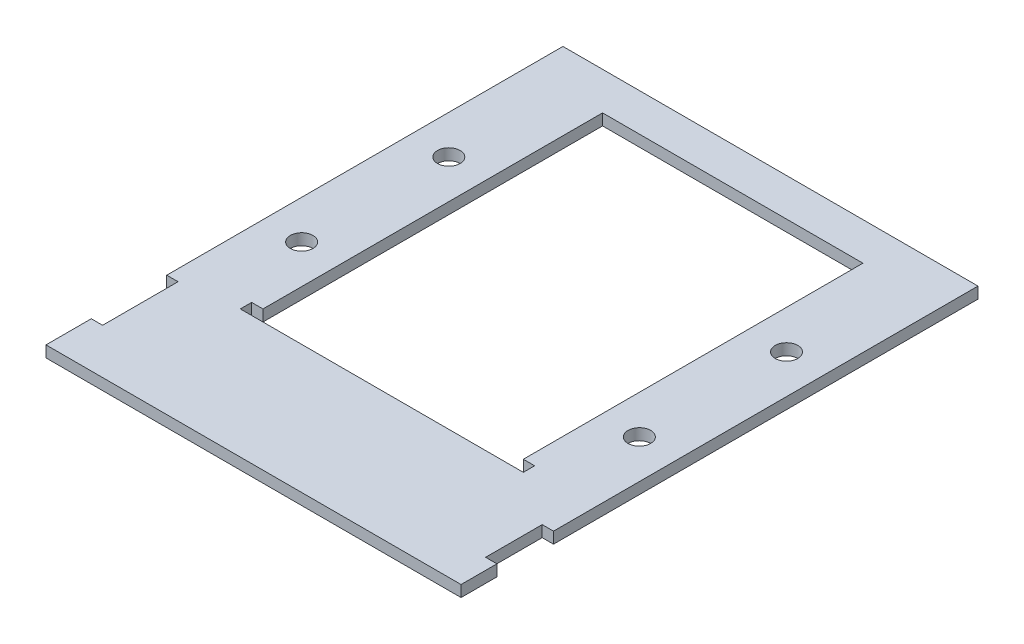
ISO-10303-21;
HEADER;
FILE_DESCRIPTION(('STEP AP214'),'2;1');
FILE_NAME('part.step','',(''),(''),'','','');
FILE_SCHEMA(('AUTOMOTIVE_DESIGN { 1 0 10303 214 1 1 1 1 }'));
ENDSEC;
DATA;
#1=APPLICATION_CONTEXT('core data for automotive mechanical design processes');
#2=APPLICATION_PROTOCOL_DEFINITION('international standard','automotive_design',2000,#1);
#3=PRODUCT_CONTEXT('',#1,'mechanical');
#4=PRODUCT('Part','Part','',(#3));
#5=PRODUCT_RELATED_PRODUCT_CATEGORY('part','',(#4));
#6=PRODUCT_DEFINITION_FORMATION('','',#4);
#7=PRODUCT_DEFINITION_CONTEXT('part definition',#1,'design');
#8=PRODUCT_DEFINITION('design','',#6,#7);
#9=PRODUCT_DEFINITION_SHAPE('','',#8);
#10=(LENGTH_UNIT() NAMED_UNIT(*) SI_UNIT(.MILLI.,.METRE.));
#11=(NAMED_UNIT(*) PLANE_ANGLE_UNIT() SI_UNIT($,.RADIAN.));
#12=(NAMED_UNIT(*) SI_UNIT($,.STERADIAN.) SOLID_ANGLE_UNIT());
#13=UNCERTAINTY_MEASURE_WITH_UNIT(LENGTH_MEASURE(1.E-05),#10,'distance_accuracy_value','');
#14=(GEOMETRIC_REPRESENTATION_CONTEXT(3) GLOBAL_UNCERTAINTY_ASSIGNED_CONTEXT((#13)) GLOBAL_UNIT_ASSIGNED_CONTEXT((#10,
#11,#12)) REPRESENTATION_CONTEXT('',''));
#15=CARTESIAN_POINT('',(0.,0.,0.));
#16=DIRECTION('',(0.,0.,1.));
#17=DIRECTION('',(1.,0.,0.));
#18=AXIS2_PLACEMENT_3D('',#15,#16,#17);
#19=CARTESIAN_POINT('',(0.,3.,-37.));
#20=DIRECTION('',(0.,0.,-1.));
#21=DIRECTION('',(-1.,0.,0.));
#22=AXIS2_PLACEMENT_3D('',#19,#20,#21);
#23=PLANE('',#22);
#24=DIRECTION('',(1.,0.,0.));
#25=VECTOR('',#24,1.);
#26=CARTESIAN_POINT('',(0.,0.,-37.));
#27=LINE('',#26,#25);
#28=CARTESIAN_POINT('',(17.5,0.,-37.));
#29=VERTEX_POINT('',#28);
#30=CARTESIAN_POINT('',(92.5,0.,-37.));
#31=VERTEX_POINT('',#30);
#32=EDGE_CURVE('E256',#29,#31,#27,.T.);
#33=ORIENTED_EDGE('',*,*,#32,.F.);
#34=DIRECTION('',(0.,-1.,0.));
#35=VECTOR('',#34,1.);
#36=CARTESIAN_POINT('',(17.5,3.,-37.));
#37=LINE('',#36,#35);
#38=CARTESIAN_POINT('',(17.5,3.,-37.));
#39=VERTEX_POINT('',#38);
#40=EDGE_CURVE('E11',#39,#29,#37,.T.);
#41=ORIENTED_EDGE('',*,*,#40,.F.);
#42=DIRECTION('',(1.,0.,0.));
#43=VECTOR('',#42,1.);
#44=CARTESIAN_POINT('',(0.,3.,-37.));
#45=LINE('',#44,#43);
#46=CARTESIAN_POINT('',(92.5,3.,-37.));
#47=VERTEX_POINT('',#46);
#48=EDGE_CURVE('E635',#39,#47,#45,.T.);
#49=ORIENTED_EDGE('',*,*,#48,.T.);
#50=DIRECTION('',(0.,-1.,0.));
#51=VECTOR('',#50,1.);
#52=CARTESIAN_POINT('',(92.5,3.,-37.));
#53=LINE('',#52,#51);
#54=EDGE_CURVE('E54',#47,#31,#53,.T.);
#55=ORIENTED_EDGE('',*,*,#54,.T.);
#56=EDGE_LOOP('',(#33,#41,#49,#55));
#57=FACE_BOUND('',#56,.T.);
#58=ADVANCED_FACE('F35',(#57),#23,.T.);
#59=CARTESIAN_POINT('',(17.5,3.,0.));
#60=DIRECTION('',(-1.,0.,0.));
#61=DIRECTION('',(0.,0.,1.));
#62=AXIS2_PLACEMENT_3D('',#59,#60,#61);
#63=PLANE('',#62);
#64=DIRECTION('',(0.,0.,-1.));
#65=VECTOR('',#64,1.);
#66=CARTESIAN_POINT('',(17.5,0.,0.));
#67=LINE('',#66,#65);
#68=CARTESIAN_POINT('',(17.5,0.,-40.));
#69=VERTEX_POINT('',#68);
#70=EDGE_CURVE('E258',#29,#69,#67,.T.);
#71=ORIENTED_EDGE('',*,*,#70,.T.);
#72=DIRECTION('',(0.,-1.,0.));
#73=VECTOR('',#72,1.);
#74=CARTESIAN_POINT('',(17.5,3.,-40.));
#75=LINE('',#74,#73);
#76=CARTESIAN_POINT('',(17.5,3.,-40.));
#77=VERTEX_POINT('',#76);
#78=EDGE_CURVE('E45',#77,#69,#75,.T.);
#79=ORIENTED_EDGE('',*,*,#78,.F.);
#80=DIRECTION('',(0.,0.,-1.));
#81=VECTOR('',#80,1.);
#82=CARTESIAN_POINT('',(17.5,3.,0.));
#83=LINE('',#82,#81);
#84=EDGE_CURVE('E633',#39,#77,#83,.T.);
#85=ORIENTED_EDGE('',*,*,#84,.F.);
#86=ORIENTED_EDGE('',*,*,#40,.T.);
#87=EDGE_LOOP('',(#71,#79,#85,#86));
#88=FACE_BOUND('',#87,.T.);
#89=ADVANCED_FACE('F380',(#88),#63,.F.);
#90=CARTESIAN_POINT('',(0.,3.,-40.));
#91=DIRECTION('',(0.,0.,-1.));
#92=DIRECTION('',(-1.,0.,0.));
#93=AXIS2_PLACEMENT_3D('',#90,#91,#92);
#94=PLANE('',#93);
#95=DIRECTION('',(1.,0.,0.));
#96=VECTOR('',#95,1.);
#97=CARTESIAN_POINT('',(0.,0.,-40.));
#98=LINE('',#97,#96);
#99=CARTESIAN_POINT('',(20.5,0.,-40.));
#100=VERTEX_POINT('',#99);
#101=EDGE_CURVE('E261',#69,#100,#98,.T.);
#102=ORIENTED_EDGE('',*,*,#101,.T.);
#103=DIRECTION('',(0.,-1.,0.));
#104=VECTOR('',#103,1.);
#105=CARTESIAN_POINT('',(20.5,3.,-40.));
#106=LINE('',#105,#104);
#107=CARTESIAN_POINT('',(20.5,3.,-40.));
#108=VERTEX_POINT('',#107);
#109=EDGE_CURVE('E285',#108,#100,#106,.T.);
#110=ORIENTED_EDGE('',*,*,#109,.F.);
#111=DIRECTION('',(1.,0.,0.));
#112=VECTOR('',#111,1.);
#113=CARTESIAN_POINT('',(0.,3.,-40.));
#114=LINE('',#113,#112);
#115=EDGE_CURVE('E629',#77,#108,#114,.T.);
#116=ORIENTED_EDGE('',*,*,#115,.F.);
#117=ORIENTED_EDGE('',*,*,#78,.T.);
#118=EDGE_LOOP('',(#102,#110,#116,#117));
#119=FACE_BOUND('',#118,.T.);
#120=ADVANCED_FACE('F385',(#119),#94,.F.);
#121=CARTESIAN_POINT('',(20.5,3.,0.));
#122=DIRECTION('',(-1.,0.,0.));
#123=DIRECTION('',(0.,0.,1.));
#124=AXIS2_PLACEMENT_3D('',#121,#122,#123);
#125=PLANE('',#124);
#126=DIRECTION('',(0.,0.,-1.));
#127=VECTOR('',#126,1.);
#128=CARTESIAN_POINT('',(20.5,0.,0.));
#129=LINE('',#128,#127);
#130=CARTESIAN_POINT('',(20.5,0.,-130.));
#131=VERTEX_POINT('',#130);
#132=EDGE_CURVE('E264',#100,#131,#129,.T.);
#133=ORIENTED_EDGE('',*,*,#132,.T.);
#134=DIRECTION('',(0.,-1.,0.));
#135=VECTOR('',#134,1.);
#136=CARTESIAN_POINT('',(20.5,3.,-130.));
#137=LINE('',#136,#135);
#138=CARTESIAN_POINT('',(20.5,3.,-130.));
#139=VERTEX_POINT('',#138);
#140=EDGE_CURVE('E283',#139,#131,#137,.T.);
#141=ORIENTED_EDGE('',*,*,#140,.F.);
#142=DIRECTION('',(0.,0.,-1.));
#143=VECTOR('',#142,1.);
#144=CARTESIAN_POINT('',(20.5,3.,0.));
#145=LINE('',#144,#143);
#146=EDGE_CURVE('E627',#108,#139,#145,.T.);
#147=ORIENTED_EDGE('',*,*,#146,.F.);
#148=ORIENTED_EDGE('',*,*,#109,.T.);
#149=EDGE_LOOP('',(#133,#141,#147,#148));
#150=FACE_BOUND('',#149,.T.);
#151=ADVANCED_FACE('F583',(#150),#125,.F.);
#152=CARTESIAN_POINT('',(0.,3.,-130.));
#153=DIRECTION('',(0.,0.,1.));
#154=DIRECTION('',(1.,0.,0.));
#155=AXIS2_PLACEMENT_3D('',#152,#153,#154);
#156=PLANE('',#155);
#157=DIRECTION('',(-1.,0.,0.));
#158=VECTOR('',#157,1.);
#159=CARTESIAN_POINT('',(0.,0.,-130.));
#160=LINE('',#159,#158);
#161=CARTESIAN_POINT('',(89.5,0.,-130.));
#162=VERTEX_POINT('',#161);
#163=EDGE_CURVE('E267',#162,#131,#160,.T.);
#164=ORIENTED_EDGE('',*,*,#163,.F.);
#165=DIRECTION('',(0.,-1.,0.));
#166=VECTOR('',#165,1.);
#167=CARTESIAN_POINT('',(89.5,3.,-130.));
#168=LINE('',#167,#166);
#169=CARTESIAN_POINT('',(89.5,3.,-130.));
#170=VERTEX_POINT('',#169);
#171=EDGE_CURVE('E188',#170,#162,#168,.T.);
#172=ORIENTED_EDGE('',*,*,#171,.F.);
#173=DIRECTION('',(-1.,0.,0.));
#174=VECTOR('',#173,1.);
#175=CARTESIAN_POINT('',(0.,3.,-130.));
#176=LINE('',#175,#174);
#177=EDGE_CURVE('E199',#170,#139,#176,.T.);
#178=ORIENTED_EDGE('',*,*,#177,.T.);
#179=ORIENTED_EDGE('',*,*,#140,.T.);
#180=EDGE_LOOP('',(#164,#172,#178,#179));
#181=FACE_BOUND('',#180,.T.);
#182=ADVANCED_FACE('F574',(#181),#156,.T.);
#183=CARTESIAN_POINT('',(89.5,3.,0.));
#184=DIRECTION('',(-1.,0.,0.));
#185=DIRECTION('',(0.,0.,1.));
#186=AXIS2_PLACEMENT_3D('',#183,#184,#185);
#187=PLANE('',#186);
#188=DIRECTION('',(0.,0.,-1.));
#189=VECTOR('',#188,1.);
#190=CARTESIAN_POINT('',(89.5,0.,0.));
#191=LINE('',#190,#189);
#192=CARTESIAN_POINT('',(89.5,0.,-40.));
#193=VERTEX_POINT('',#192);
#194=EDGE_CURVE('E184',#193,#162,#191,.T.);
#195=ORIENTED_EDGE('',*,*,#194,.F.);
#196=DIRECTION('',(0.,-1.,0.));
#197=VECTOR('',#196,1.);
#198=CARTESIAN_POINT('',(89.5,3.,-40.));
#199=LINE('',#198,#197);
#200=CARTESIAN_POINT('',(89.5,3.,-40.));
#201=VERTEX_POINT('',#200);
#202=EDGE_CURVE('E179',#201,#193,#199,.T.);
#203=ORIENTED_EDGE('',*,*,#202,.F.);
#204=DIRECTION('',(0.,0.,-1.));
#205=VECTOR('',#204,1.);
#206=CARTESIAN_POINT('',(89.5,3.,0.));
#207=LINE('',#206,#205);
#208=EDGE_CURVE('E182',#201,#170,#207,.T.);
#209=ORIENTED_EDGE('',*,*,#208,.T.);
#210=ORIENTED_EDGE('',*,*,#171,.T.);
#211=EDGE_LOOP('',(#195,#203,#209,#210));
#212=FACE_BOUND('',#211,.T.);
#213=ADVANCED_FACE('F181',(#212),#187,.T.);
#214=CARTESIAN_POINT('',(0.,3.,-40.));
#215=DIRECTION('',(0.,0.,1.));
#216=DIRECTION('',(1.,0.,0.));
#217=AXIS2_PLACEMENT_3D('',#214,#215,#216);
#218=PLANE('',#217);
#219=DIRECTION('',(-1.,0.,0.));
#220=VECTOR('',#219,1.);
#221=CARTESIAN_POINT('',(0.,0.,-40.));
#222=LINE('',#221,#220);
#223=CARTESIAN_POINT('',(92.5,0.,-40.));
#224=VERTEX_POINT('',#223);
#225=EDGE_CURVE('E271',#224,#193,#222,.T.);
#226=ORIENTED_EDGE('',*,*,#225,.F.);
#227=DIRECTION('',(0.,-1.,0.));
#228=VECTOR('',#227,1.);
#229=CARTESIAN_POINT('',(92.5,3.,-40.));
#230=LINE('',#229,#228);
#231=CARTESIAN_POINT('',(92.5,3.,-40.));
#232=VERTEX_POINT('',#231);
#233=EDGE_CURVE('E115',#232,#224,#230,.T.);
#234=ORIENTED_EDGE('',*,*,#233,.F.);
#235=DIRECTION('',(-1.,0.,0.));
#236=VECTOR('',#235,1.);
#237=CARTESIAN_POINT('',(0.,3.,-40.));
#238=LINE('',#237,#236);
#239=EDGE_CURVE('E197',#232,#201,#238,.T.);
#240=ORIENTED_EDGE('',*,*,#239,.T.);
#241=ORIENTED_EDGE('',*,*,#202,.T.);
#242=EDGE_LOOP('',(#226,#234,#240,#241));
#243=FACE_BOUND('',#242,.T.);
#244=ADVANCED_FACE('F201',(#243),#218,.T.);
#245=CARTESIAN_POINT('',(0.,3.,-3.));
#246=DIRECTION('',(0.,0.,1.));
#247=DIRECTION('',(1.,0.,0.));
#248=AXIS2_PLACEMENT_3D('',#245,#246,#247);
#249=PLANE('',#248);
#250=DIRECTION('',(-1.,0.,0.));
#251=VECTOR('',#250,1.);
#252=CARTESIAN_POINT('',(0.,0.,-3.));
#253=LINE('',#252,#251);
#254=CARTESIAN_POINT('',(110.,0.,-3.));
#255=VERTEX_POINT('',#254);
#256=CARTESIAN_POINT('',(0.,0.,-3.));
#257=VERTEX_POINT('',#256);
#258=EDGE_CURVE('E220',#255,#257,#253,.T.);
#259=ORIENTED_EDGE('',*,*,#258,.F.);
#260=DIRECTION('',(0.,-1.,0.));
#261=VECTOR('',#260,1.);
#262=CARTESIAN_POINT('',(110.,3.,-3.));
#263=LINE('',#262,#261);
#264=CARTESIAN_POINT('',(110.,3.,-3.));
#265=VERTEX_POINT('',#264);
#266=EDGE_CURVE('E39',#265,#255,#263,.T.);
#267=ORIENTED_EDGE('',*,*,#266,.F.);
#268=DIRECTION('',(-1.,0.,0.));
#269=VECTOR('',#268,1.);
#270=CARTESIAN_POINT('',(0.,3.,-3.));
#271=LINE('',#270,#269);
#272=CARTESIAN_POINT('',(0.,3.,-3.));
#273=VERTEX_POINT('',#272);
#274=EDGE_CURVE('E326',#265,#273,#271,.T.);
#275=ORIENTED_EDGE('',*,*,#274,.T.);
#276=DIRECTION('',(0.,-1.,0.));
#277=VECTOR('',#276,1.);
#278=CARTESIAN_POINT('',(0.,3.,-3.));
#279=LINE('',#278,#277);
#280=EDGE_CURVE('E210',#273,#257,#279,.T.);
#281=ORIENTED_EDGE('',*,*,#280,.T.);
#282=EDGE_LOOP('',(#259,#267,#275,#281));
#283=FACE_BOUND('',#282,.T.);
#284=ADVANCED_FACE('F324',(#283),#249,.T.);
#285=CARTESIAN_POINT('',(110.,3.,0.));
#286=DIRECTION('',(-1.,0.,0.));
#287=DIRECTION('',(0.,0.,1.));
#288=AXIS2_PLACEMENT_3D('',#285,#286,#287);
#289=PLANE('',#288);
#290=DIRECTION('',(0.,0.,-1.));
#291=VECTOR('',#290,1.);
#292=CARTESIAN_POINT('',(110.,0.,0.));
#293=LINE('',#292,#291);
#294=CARTESIAN_POINT('',(110.,0.,-12.5));
#295=VERTEX_POINT('',#294);
#296=EDGE_CURVE('E223',#255,#295,#293,.T.);
#297=ORIENTED_EDGE('',*,*,#296,.T.);
#298=DIRECTION('',(0.,-1.,0.));
#299=VECTOR('',#298,1.);
#300=CARTESIAN_POINT('',(110.,3.,-12.5));
#301=LINE('',#300,#299);
#302=CARTESIAN_POINT('',(110.,3.,-12.5));
#303=VERTEX_POINT('',#302);
#304=EDGE_CURVE('E311',#303,#295,#301,.T.);
#305=ORIENTED_EDGE('',*,*,#304,.F.);
#306=DIRECTION('',(0.,0.,-1.));
#307=VECTOR('',#306,1.);
#308=CARTESIAN_POINT('',(110.,3.,0.));
#309=LINE('',#308,#307);
#310=EDGE_CURVE('E319',#265,#303,#309,.T.);
#311=ORIENTED_EDGE('',*,*,#310,.F.);
#312=ORIENTED_EDGE('',*,*,#266,.T.);
#313=EDGE_LOOP('',(#297,#305,#311,#312));
#314=FACE_BOUND('',#313,.T.);
#315=ADVANCED_FACE('F318',(#314),#289,.F.);
#316=CARTESIAN_POINT('',(0.,3.,-12.5));
#317=DIRECTION('',(0.,0.,-1.));
#318=DIRECTION('',(-1.,0.,0.));
#319=AXIS2_PLACEMENT_3D('',#316,#317,#318);
#320=PLANE('',#319);
#321=DIRECTION('',(1.,0.,0.));
#322=VECTOR('',#321,1.);
#323=CARTESIAN_POINT('',(0.,0.,-12.5));
#324=LINE('',#323,#322);
#325=CARTESIAN_POINT('',(107.,0.,-12.5));
#326=VERTEX_POINT('',#325);
#327=EDGE_CURVE('E226',#326,#295,#324,.T.);
#328=ORIENTED_EDGE('',*,*,#327,.F.);
#329=DIRECTION('',(0.,-1.,0.));
#330=VECTOR('',#329,1.);
#331=CARTESIAN_POINT('',(107.,3.,-12.5));
#332=LINE('',#331,#330);
#333=CARTESIAN_POINT('',(107.,3.,-12.5));
#334=VERTEX_POINT('',#333);
#335=EDGE_CURVE('E310',#334,#326,#332,.T.);
#336=ORIENTED_EDGE('',*,*,#335,.F.);
#337=DIRECTION('',(1.,0.,0.));
#338=VECTOR('',#337,1.);
#339=CARTESIAN_POINT('',(0.,3.,-12.5));
#340=LINE('',#339,#338);
#341=EDGE_CURVE('E655',#334,#303,#340,.T.);
#342=ORIENTED_EDGE('',*,*,#341,.T.);
#343=ORIENTED_EDGE('',*,*,#304,.T.);
#344=EDGE_LOOP('',(#328,#336,#342,#343));
#345=FACE_BOUND('',#344,.T.);
#346=ADVANCED_FACE('F369',(#345),#320,.T.);
#347=CARTESIAN_POINT('',(107.,3.,0.));
#348=DIRECTION('',(1.,0.,0.));
#349=DIRECTION('',(0.,0.,-1.));
#350=AXIS2_PLACEMENT_3D('',#347,#348,#349);
#351=PLANE('',#350);
#352=DIRECTION('',(0.,0.,1.));
#353=VECTOR('',#352,1.);
#354=CARTESIAN_POINT('',(107.,0.,0.));
#355=LINE('',#354,#353);
#356=CARTESIAN_POINT('',(107.,0.,-27.5));
#357=VERTEX_POINT('',#356);
#358=EDGE_CURVE('E229',#357,#326,#355,.T.);
#359=ORIENTED_EDGE('',*,*,#358,.F.);
#360=DIRECTION('',(0.,-1.,0.));
#361=VECTOR('',#360,1.);
#362=CARTESIAN_POINT('',(107.,3.,-27.5));
#363=LINE('',#362,#361);
#364=CARTESIAN_POINT('',(107.,3.,-27.5));
#365=VERTEX_POINT('',#364);
#366=EDGE_CURVE('E308',#365,#357,#363,.T.);
#367=ORIENTED_EDGE('',*,*,#366,.F.);
#368=DIRECTION('',(0.,0.,1.));
#369=VECTOR('',#368,1.);
#370=CARTESIAN_POINT('',(107.,3.,0.));
#371=LINE('',#370,#369);
#372=EDGE_CURVE('E367',#365,#334,#371,.T.);
#373=ORIENTED_EDGE('',*,*,#372,.T.);
#374=ORIENTED_EDGE('',*,*,#335,.T.);
#375=EDGE_LOOP('',(#359,#367,#373,#374));
#376=FACE_BOUND('',#375,.T.);
#377=ADVANCED_FACE('F363',(#376),#351,.T.);
#378=CARTESIAN_POINT('',(0.,3.,-27.5));
#379=DIRECTION('',(0.,0.,-1.));
#380=DIRECTION('',(-1.,0.,0.));
#381=AXIS2_PLACEMENT_3D('',#378,#379,#380);
#382=PLANE('',#381);
#383=DIRECTION('',(1.,0.,0.));
#384=VECTOR('',#383,1.);
#385=CARTESIAN_POINT('',(0.,0.,-27.5));
#386=LINE('',#385,#384);
#387=CARTESIAN_POINT('',(110.,0.,-27.5));
#388=VERTEX_POINT('',#387);
#389=EDGE_CURVE('E232',#357,#388,#386,.T.);
#390=ORIENTED_EDGE('',*,*,#389,.T.);
#391=DIRECTION('',(0.,-1.,0.));
#392=VECTOR('',#391,1.);
#393=CARTESIAN_POINT('',(110.,3.,-27.5));
#394=LINE('',#393,#392);
#395=CARTESIAN_POINT('',(110.,3.,-27.5));
#396=VERTEX_POINT('',#395);
#397=EDGE_CURVE('E305',#396,#388,#394,.T.);
#398=ORIENTED_EDGE('',*,*,#397,.F.);
#399=DIRECTION('',(1.,0.,0.));
#400=VECTOR('',#399,1.);
#401=CARTESIAN_POINT('',(0.,3.,-27.5));
#402=LINE('',#401,#400);
#403=EDGE_CURVE('E651',#365,#396,#402,.T.);
#404=ORIENTED_EDGE('',*,*,#403,.F.);
#405=ORIENTED_EDGE('',*,*,#366,.T.);
#406=EDGE_LOOP('',(#390,#398,#404,#405));
#407=FACE_BOUND('',#406,.T.);
#408=ADVANCED_FACE('F376',(#407),#382,.F.);
#409=CARTESIAN_POINT('',(110.,3.,0.));
#410=DIRECTION('',(-1.,0.,0.));
#411=DIRECTION('',(0.,0.,1.));
#412=AXIS2_PLACEMENT_3D('',#409,#410,#411);
#413=PLANE('',#412);
#414=DIRECTION('',(0.,0.,-1.));
#415=VECTOR('',#414,1.);
#416=CARTESIAN_POINT('',(110.,0.,0.));
#417=LINE('',#416,#415);
#418=CARTESIAN_POINT('',(110.,0.,-140.));
#419=VERTEX_POINT('',#418);
#420=EDGE_CURVE('E235',#388,#419,#417,.T.);
#421=ORIENTED_EDGE('',*,*,#420,.T.);
#422=DIRECTION('',(0.,-1.,0.));
#423=VECTOR('',#422,1.);
#424=CARTESIAN_POINT('',(110.,3.,-140.));
#425=LINE('',#424,#423);
#426=CARTESIAN_POINT('',(110.,3.,-140.));
#427=VERTEX_POINT('',#426);
#428=EDGE_CURVE('E302',#427,#419,#425,.T.);
#429=ORIENTED_EDGE('',*,*,#428,.F.);
#430=DIRECTION('',(0.,0.,-1.));
#431=VECTOR('',#430,1.);
#432=CARTESIAN_POINT('',(110.,3.,0.));
#433=LINE('',#432,#431);
#434=EDGE_CURVE('E649',#396,#427,#433,.T.);
#435=ORIENTED_EDGE('',*,*,#434,.F.);
#436=ORIENTED_EDGE('',*,*,#397,.T.);
#437=EDGE_LOOP('',(#421,#429,#435,#436));
#438=FACE_BOUND('',#437,.T.);
#439=ADVANCED_FACE('F357',(#438),#413,.F.);
#440=CARTESIAN_POINT('',(0.,3.,-140.));
#441=DIRECTION('',(0.,0.,1.));
#442=DIRECTION('',(1.,0.,0.));
#443=AXIS2_PLACEMENT_3D('',#440,#441,#442);
#444=PLANE('',#443);
#445=DIRECTION('',(-1.,0.,0.));
#446=VECTOR('',#445,1.);
#447=CARTESIAN_POINT('',(0.,0.,-140.));
#448=LINE('',#447,#446);
#449=CARTESIAN_POINT('',(0.,0.,-140.));
#450=VERTEX_POINT('',#449);
#451=EDGE_CURVE('E238',#419,#450,#448,.T.);
#452=ORIENTED_EDGE('',*,*,#451,.T.);
#453=DIRECTION('',(0.,-1.,0.));
#454=VECTOR('',#453,1.);
#455=CARTESIAN_POINT('',(0.,3.,-140.));
#456=LINE('',#455,#454);
#457=CARTESIAN_POINT('',(0.,3.,-140.));
#458=VERTEX_POINT('',#457);
#459=EDGE_CURVE('E300',#458,#450,#456,.T.);
#460=ORIENTED_EDGE('',*,*,#459,.F.);
#461=DIRECTION('',(-1.,0.,0.));
#462=VECTOR('',#461,1.);
#463=CARTESIAN_POINT('',(0.,3.,-140.));
#464=LINE('',#463,#462);
#465=EDGE_CURVE('E354',#427,#458,#464,.T.);
#466=ORIENTED_EDGE('',*,*,#465,.F.);
#467=ORIENTED_EDGE('',*,*,#428,.T.);
#468=EDGE_LOOP('',(#452,#460,#466,#467));
#469=FACE_BOUND('',#468,.T.);
#470=ADVANCED_FACE('F352',(#469),#444,.F.);
#471=CARTESIAN_POINT('',(0.,3.,0.));
#472=DIRECTION('',(-1.,0.,0.));
#473=DIRECTION('',(0.,0.,1.));
#474=AXIS2_PLACEMENT_3D('',#471,#472,#473);
#475=PLANE('',#474);
#476=DIRECTION('',(0.,0.,-1.));
#477=VECTOR('',#476,1.);
#478=CARTESIAN_POINT('',(0.,0.,0.));
#479=LINE('',#478,#477);
#480=CARTESIAN_POINT('',(0.,0.,-35.));
#481=VERTEX_POINT('',#480);
#482=EDGE_CURVE('E241',#481,#450,#479,.T.);
#483=ORIENTED_EDGE('',*,*,#482,.F.);
#484=DIRECTION('',(0.,-1.,0.));
#485=VECTOR('',#484,1.);
#486=CARTESIAN_POINT('',(0.,3.,-35.));
#487=LINE('',#486,#485);
#488=CARTESIAN_POINT('',(0.,3.,-35.));
#489=VERTEX_POINT('',#488);
#490=EDGE_CURVE('E298',#489,#481,#487,.T.);
#491=ORIENTED_EDGE('',*,*,#490,.F.);
#492=DIRECTION('',(0.,0.,-1.));
#493=VECTOR('',#492,1.);
#494=CARTESIAN_POINT('',(0.,3.,0.));
#495=LINE('',#494,#493);
#496=EDGE_CURVE('E350',#489,#458,#495,.T.);
#497=ORIENTED_EDGE('',*,*,#496,.T.);
#498=ORIENTED_EDGE('',*,*,#459,.T.);
#499=EDGE_LOOP('',(#483,#491,#497,#498));
#500=FACE_BOUND('',#499,.T.);
#501=ADVANCED_FACE('F346',(#500),#475,.T.);
#502=CARTESIAN_POINT('',(0.,3.,-35.));
#503=DIRECTION('',(0.,0.,1.));
#504=DIRECTION('',(1.,0.,0.));
#505=AXIS2_PLACEMENT_3D('',#502,#503,#504);
#506=PLANE('',#505);
#507=DIRECTION('',(-1.,0.,0.));
#508=VECTOR('',#507,1.);
#509=CARTESIAN_POINT('',(0.,0.,-35.));
#510=LINE('',#509,#508);
#511=CARTESIAN_POINT('',(3.,0.,-35.));
#512=VERTEX_POINT('',#511);
#513=EDGE_CURVE('E244',#512,#481,#510,.T.);
#514=ORIENTED_EDGE('',*,*,#513,.F.);
#515=DIRECTION('',(0.,-1.,0.));
#516=VECTOR('',#515,1.);
#517=CARTESIAN_POINT('',(3.,3.,-35.));
#518=LINE('',#517,#516);
#519=CARTESIAN_POINT('',(3.,3.,-35.));
#520=VERTEX_POINT('',#519);
#521=EDGE_CURVE('E296',#520,#512,#518,.T.);
#522=ORIENTED_EDGE('',*,*,#521,.F.);
#523=DIRECTION('',(-1.,0.,0.));
#524=VECTOR('',#523,1.);
#525=CARTESIAN_POINT('',(0.,3.,-35.));
#526=LINE('',#525,#524);
#527=EDGE_CURVE('E645',#520,#489,#526,.T.);
#528=ORIENTED_EDGE('',*,*,#527,.T.);
#529=ORIENTED_EDGE('',*,*,#490,.T.);
#530=EDGE_LOOP('',(#514,#522,#528,#529));
#531=FACE_BOUND('',#530,.T.);
#532=ADVANCED_FACE('F343',(#531),#506,.T.);
#533=CARTESIAN_POINT('',(3.,3.,0.));
#534=DIRECTION('',(-1.,0.,0.));
#535=DIRECTION('',(0.,0.,1.));
#536=AXIS2_PLACEMENT_3D('',#533,#534,#535);
#537=PLANE('',#536);
#538=DIRECTION('',(0.,0.,-1.));
#539=VECTOR('',#538,1.);
#540=CARTESIAN_POINT('',(3.,0.,0.));
#541=LINE('',#540,#539);
#542=CARTESIAN_POINT('',(3.,0.,-15.));
#543=VERTEX_POINT('',#542);
#544=EDGE_CURVE('E247',#543,#512,#541,.T.);
#545=ORIENTED_EDGE('',*,*,#544,.F.);
#546=DIRECTION('',(0.,-1.,0.));
#547=VECTOR('',#546,1.);
#548=CARTESIAN_POINT('',(3.,3.,-15.));
#549=LINE('',#548,#547);
#550=CARTESIAN_POINT('',(3.,3.,-15.));
#551=VERTEX_POINT('',#550);
#552=EDGE_CURVE('E294',#551,#543,#549,.T.);
#553=ORIENTED_EDGE('',*,*,#552,.F.);
#554=DIRECTION('',(0.,0.,-1.));
#555=VECTOR('',#554,1.);
#556=CARTESIAN_POINT('',(3.,3.,0.));
#557=LINE('',#556,#555);
#558=EDGE_CURVE('E339',#551,#520,#557,.T.);
#559=ORIENTED_EDGE('',*,*,#558,.T.);
#560=ORIENTED_EDGE('',*,*,#521,.T.);
#561=EDGE_LOOP('',(#545,#553,#559,#560));
#562=FACE_BOUND('',#561,.T.);
#563=ADVANCED_FACE('F334',(#562),#537,.T.);
#564=CARTESIAN_POINT('',(0.,3.,-15.));
#565=DIRECTION('',(0.,0.,1.));
#566=DIRECTION('',(1.,0.,0.));
#567=AXIS2_PLACEMENT_3D('',#564,#565,#566);
#568=PLANE('',#567);
#569=DIRECTION('',(-1.,0.,0.));
#570=VECTOR('',#569,1.);
#571=CARTESIAN_POINT('',(0.,0.,-15.));
#572=LINE('',#571,#570);
#573=CARTESIAN_POINT('',(0.,0.,-15.));
#574=VERTEX_POINT('',#573);
#575=EDGE_CURVE('E250',#543,#574,#572,.T.);
#576=ORIENTED_EDGE('',*,*,#575,.T.);
#577=DIRECTION('',(0.,-1.,0.));
#578=VECTOR('',#577,1.);
#579=CARTESIAN_POINT('',(0.,3.,-15.));
#580=LINE('',#579,#578);
#581=CARTESIAN_POINT('',(0.,3.,-15.));
#582=VERTEX_POINT('',#581);
#583=EDGE_CURVE('E291',#582,#574,#580,.T.);
#584=ORIENTED_EDGE('',*,*,#583,.F.);
#585=DIRECTION('',(-1.,0.,0.));
#586=VECTOR('',#585,1.);
#587=CARTESIAN_POINT('',(0.,3.,-15.));
#588=LINE('',#587,#586);
#589=EDGE_CURVE('E639',#551,#582,#588,.T.);
#590=ORIENTED_EDGE('',*,*,#589,.F.);
#591=ORIENTED_EDGE('',*,*,#552,.T.);
#592=EDGE_LOOP('',(#576,#584,#590,#591));
#593=FACE_BOUND('',#592,.T.);
#594=ADVANCED_FACE('F394',(#593),#568,.F.);
#595=CARTESIAN_POINT('',(92.5,3.,0.));
#596=DIRECTION('',(-1.,0.,0.));
#597=DIRECTION('',(0.,0.,1.));
#598=AXIS2_PLACEMENT_3D('',#595,#596,#597);
#599=PLANE('',#598);
#600=DIRECTION('',(0.,0.,-1.));
#601=VECTOR('',#600,1.);
#602=CARTESIAN_POINT('',(92.5,0.,0.));
#603=LINE('',#602,#601);
#604=EDGE_CURVE('E273',#31,#224,#603,.T.);
#605=ORIENTED_EDGE('',*,*,#604,.F.);
#606=ORIENTED_EDGE('',*,*,#54,.F.);
#607=DIRECTION('',(0.,0.,-1.));
#608=VECTOR('',#607,1.);
#609=CARTESIAN_POINT('',(92.5,3.,0.));
#610=LINE('',#609,#608);
#611=EDGE_CURVE('E202',#47,#232,#610,.T.);
#612=ORIENTED_EDGE('',*,*,#611,.T.);
#613=ORIENTED_EDGE('',*,*,#233,.T.);
#614=EDGE_LOOP('',(#605,#606,#612,#613));
#615=FACE_BOUND('',#614,.T.);
#616=ADVANCED_FACE('F393',(#615),#599,.T.);
#617=CARTESIAN_POINT('',(0.,3.,0.));
#618=DIRECTION('',(1.,0.,0.));
#619=DIRECTION('',(0.,0.,-1.));
#620=AXIS2_PLACEMENT_3D('',#617,#618,#619);
#621=PLANE('',#620);
#622=DIRECTION('',(0.,0.,1.));
#623=VECTOR('',#622,1.);
#624=CARTESIAN_POINT('',(0.,0.,0.));
#625=LINE('',#624,#623);
#626=EDGE_CURVE('E253',#574,#257,#625,.T.);
#627=ORIENTED_EDGE('',*,*,#626,.T.);
#628=ORIENTED_EDGE('',*,*,#280,.F.);
#629=DIRECTION('',(0.,0.,1.));
#630=VECTOR('',#629,1.);
#631=CARTESIAN_POINT('',(0.,3.,0.));
#632=LINE('',#631,#630);
#633=EDGE_CURVE('E638',#582,#273,#632,.T.);
#634=ORIENTED_EDGE('',*,*,#633,.F.);
#635=ORIENTED_EDGE('',*,*,#583,.T.);
#636=EDGE_LOOP('',(#627,#628,#634,#635));
#637=FACE_BOUND('',#636,.T.);
#638=ADVANCED_FACE('F328',(#637),#621,.F.);
#639=CARTESIAN_POINT('',(99.75,3.,-60.5));
#640=DIRECTION('',(0.,-1.,0.));
#641=DIRECTION('',(0.,0.,-1.));
#642=AXIS2_PLACEMENT_3D('',#639,#640,#641);
#643=CYLINDRICAL_SURFACE('',#642,3.00000000000001);
#644=CARTESIAN_POINT('',(99.75,3.,-60.5));
#645=DIRECTION('',(0.,1.,0.));
#646=DIRECTION('',(0.,0.,1.));
#647=AXIS2_PLACEMENT_3D('',#644,#645,#646);
#648=CIRCLE('',#647,3.00000000000001);
#649=CARTESIAN_POINT('',(99.75,3.,-57.5));
#650=VERTEX_POINT('',#649);
#651=EDGE_CURVE('E659',#650,#650,#648,.T.);
#652=ORIENTED_EDGE('',*,*,#651,.T.);
#653=EDGE_LOOP('',(#652));
#654=FACE_BOUND('',#653,.T.);
#655=CARTESIAN_POINT('',(99.75,0.,-60.5));
#656=DIRECTION('',(0.,1.,0.));
#657=DIRECTION('',(0.,0.,1.));
#658=AXIS2_PLACEMENT_3D('',#655,#656,#657);
#659=CIRCLE('',#658,3.00000000000001);
#660=CARTESIAN_POINT('',(99.75,0.,-57.5));
#661=VERTEX_POINT('',#660);
#662=EDGE_CURVE('E217',#661,#661,#659,.T.);
#663=ORIENTED_EDGE('',*,*,#662,.F.);
#664=EDGE_LOOP('',(#663));
#665=FACE_BOUND('',#664,.T.);
#666=ADVANCED_FACE('F392',(#654,#665),#643,.F.);
#667=CARTESIAN_POINT('',(99.75,3.,-99.5));
#668=DIRECTION('',(0.,-1.,0.));
#669=DIRECTION('',(0.,0.,-1.));
#670=AXIS2_PLACEMENT_3D('',#667,#668,#669);
#671=CYLINDRICAL_SURFACE('',#670,3.00000000000001);
#672=CARTESIAN_POINT('',(99.75,3.,-99.5));
#673=DIRECTION('',(0.,1.,0.));
#674=DIRECTION('',(0.,0.,1.));
#675=AXIS2_PLACEMENT_3D('',#672,#673,#674);
#676=CIRCLE('',#675,3.00000000000001);
#677=CARTESIAN_POINT('',(99.75,3.,-96.5));
#678=VERTEX_POINT('',#677);
#679=EDGE_CURVE('E662',#678,#678,#676,.T.);
#680=ORIENTED_EDGE('',*,*,#679,.T.);
#681=EDGE_LOOP('',(#680));
#682=FACE_BOUND('',#681,.T.);
#683=CARTESIAN_POINT('',(99.75,0.,-99.5));
#684=DIRECTION('',(0.,1.,0.));
#685=DIRECTION('',(0.,0.,1.));
#686=AXIS2_PLACEMENT_3D('',#683,#684,#685);
#687=CIRCLE('',#686,3.00000000000001);
#688=CARTESIAN_POINT('',(99.75,0.,-96.5));
#689=VERTEX_POINT('',#688);
#690=EDGE_CURVE('E214',#689,#689,#687,.T.);
#691=ORIENTED_EDGE('',*,*,#690,.F.);
#692=EDGE_LOOP('',(#691));
#693=FACE_BOUND('',#692,.T.);
#694=ADVANCED_FACE('F452',(#682,#693),#671,.F.);
#695=CARTESIAN_POINT('',(10.25,3.,-99.5));
#696=DIRECTION('',(0.,-1.,0.));
#697=DIRECTION('',(0.,0.,-1.));
#698=AXIS2_PLACEMENT_3D('',#695,#696,#697);
#699=CYLINDRICAL_SURFACE('',#698,3.00000000000001);
#700=CARTESIAN_POINT('',(10.25,3.,-99.5));
#701=DIRECTION('',(0.,1.,0.));
#702=DIRECTION('',(0.,0.,1.));
#703=AXIS2_PLACEMENT_3D('',#700,#701,#702);
#704=CIRCLE('',#703,3.00000000000001);
#705=CARTESIAN_POINT('',(10.25,3.,-96.5));
#706=VERTEX_POINT('',#705);
#707=EDGE_CURVE('E279',#706,#706,#704,.F.);
#708=ORIENTED_EDGE('',*,*,#707,.F.);
#709=EDGE_LOOP('',(#708));
#710=FACE_BOUND('',#709,.T.);
#711=CARTESIAN_POINT('',(10.25,0.,-99.5));
#712=DIRECTION('',(0.,1.,0.));
#713=DIRECTION('',(0.,0.,1.));
#714=AXIS2_PLACEMENT_3D('',#711,#712,#713);
#715=CIRCLE('',#714,3.00000000000001);
#716=CARTESIAN_POINT('',(10.25,0.,-96.5));
#717=VERTEX_POINT('',#716);
#718=EDGE_CURVE('E211',#717,#717,#715,.F.);
#719=ORIENTED_EDGE('',*,*,#718,.T.);
#720=EDGE_LOOP('',(#719));
#721=FACE_BOUND('',#720,.T.);
#722=ADVANCED_FACE('F37',(#710,#721),#699,.F.);
#723=CARTESIAN_POINT('',(10.25,3.,-60.5));
#724=DIRECTION('',(0.,-1.,0.));
#725=DIRECTION('',(0.,0.,-1.));
#726=AXIS2_PLACEMENT_3D('',#723,#724,#725);
#727=CYLINDRICAL_SURFACE('',#726,3.00000000000001);
#728=CARTESIAN_POINT('',(10.25,3.,-60.5));
#729=DIRECTION('',(0.,1.,0.));
#730=DIRECTION('',(0.,0.,1.));
#731=AXIS2_PLACEMENT_3D('',#728,#729,#730);
#732=CIRCLE('',#731,3.00000000000001);
#733=CARTESIAN_POINT('',(10.25,3.,-57.5));
#734=VERTEX_POINT('',#733);
#735=EDGE_CURVE('E204',#734,#734,#732,.F.);
#736=ORIENTED_EDGE('',*,*,#735,.F.);
#737=EDGE_LOOP('',(#736));
#738=FACE_BOUND('',#737,.T.);
#739=CARTESIAN_POINT('',(10.25,0.,-60.5));
#740=DIRECTION('',(0.,1.,0.));
#741=DIRECTION('',(0.,0.,1.));
#742=AXIS2_PLACEMENT_3D('',#739,#740,#741);
#743=CIRCLE('',#742,3.00000000000001);
#744=CARTESIAN_POINT('',(10.25,0.,-57.5));
#745=VERTEX_POINT('',#744);
#746=EDGE_CURVE('E276',#745,#745,#743,.F.);
#747=ORIENTED_EDGE('',*,*,#746,.T.);
#748=EDGE_LOOP('',(#747));
#749=FACE_BOUND('',#748,.T.);
#750=ADVANCED_FACE('F466',(#738,#749),#727,.F.);
#751=CARTESIAN_POINT('',(0.,3.,0.));
#752=DIRECTION('',(0.,1.,0.));
#753=DIRECTION('',(0.,0.,1.));
#754=AXIS2_PLACEMENT_3D('',#751,#752,#753);
#755=PLANE('',#754);
#756=ORIENTED_EDGE('',*,*,#707,.T.);
#757=EDGE_LOOP('',(#756));
#758=FACE_BOUND('',#757,.T.);
#759=ORIENTED_EDGE('',*,*,#679,.F.);
#760=EDGE_LOOP('',(#759));
#761=FACE_BOUND('',#760,.T.);
#762=ORIENTED_EDGE('',*,*,#651,.F.);
#763=EDGE_LOOP('',(#762));
#764=FACE_BOUND('',#763,.T.);
#765=ORIENTED_EDGE('',*,*,#274,.F.);
#766=ORIENTED_EDGE('',*,*,#310,.T.);
#767=ORIENTED_EDGE('',*,*,#341,.F.);
#768=ORIENTED_EDGE('',*,*,#372,.F.);
#769=ORIENTED_EDGE('',*,*,#403,.T.);
#770=ORIENTED_EDGE('',*,*,#434,.T.);
#771=ORIENTED_EDGE('',*,*,#465,.T.);
#772=ORIENTED_EDGE('',*,*,#496,.F.);
#773=ORIENTED_EDGE('',*,*,#527,.F.);
#774=ORIENTED_EDGE('',*,*,#558,.F.);
#775=ORIENTED_EDGE('',*,*,#589,.T.);
#776=ORIENTED_EDGE('',*,*,#633,.T.);
#777=EDGE_LOOP('',(#765,#766,#767,#768,#769,#770,#771,#772,#773,#774,#775,#776));
#778=FACE_BOUND('',#777,.T.);
#779=ORIENTED_EDGE('',*,*,#48,.F.);
#780=ORIENTED_EDGE('',*,*,#84,.T.);
#781=ORIENTED_EDGE('',*,*,#115,.T.);
#782=ORIENTED_EDGE('',*,*,#146,.T.);
#783=ORIENTED_EDGE('',*,*,#177,.F.);
#784=ORIENTED_EDGE('',*,*,#208,.F.);
#785=ORIENTED_EDGE('',*,*,#239,.F.);
#786=ORIENTED_EDGE('',*,*,#611,.F.);
#787=EDGE_LOOP('',(#779,#780,#781,#782,#783,#784,#785,#786));
#788=FACE_BOUND('',#787,.T.);
#789=ORIENTED_EDGE('',*,*,#735,.T.);
#790=EDGE_LOOP('',(#789));
#791=FACE_BOUND('',#790,.T.);
#792=ADVANCED_FACE('F194',(#758,#761,#764,#778,#788,#791),#755,.T.);
#793=CARTESIAN_POINT('',(0.,0.,0.));
#794=DIRECTION('',(0.,1.,0.));
#795=DIRECTION('',(0.,0.,1.));
#796=AXIS2_PLACEMENT_3D('',#793,#794,#795);
#797=PLANE('',#796);
#798=ORIENTED_EDGE('',*,*,#718,.F.);
#799=EDGE_LOOP('',(#798));
#800=FACE_BOUND('',#799,.T.);
#801=ORIENTED_EDGE('',*,*,#690,.T.);
#802=EDGE_LOOP('',(#801));
#803=FACE_BOUND('',#802,.T.);
#804=ORIENTED_EDGE('',*,*,#662,.T.);
#805=EDGE_LOOP('',(#804));
#806=FACE_BOUND('',#805,.T.);
#807=ORIENTED_EDGE('',*,*,#258,.T.);
#808=ORIENTED_EDGE('',*,*,#626,.F.);
#809=ORIENTED_EDGE('',*,*,#575,.F.);
#810=ORIENTED_EDGE('',*,*,#544,.T.);
#811=ORIENTED_EDGE('',*,*,#513,.T.);
#812=ORIENTED_EDGE('',*,*,#482,.T.);
#813=ORIENTED_EDGE('',*,*,#451,.F.);
#814=ORIENTED_EDGE('',*,*,#420,.F.);
#815=ORIENTED_EDGE('',*,*,#389,.F.);
#816=ORIENTED_EDGE('',*,*,#358,.T.);
#817=ORIENTED_EDGE('',*,*,#327,.T.);
#818=ORIENTED_EDGE('',*,*,#296,.F.);
#819=EDGE_LOOP('',(#807,#808,#809,#810,#811,#812,#813,#814,#815,#816,#817,#818));
#820=FACE_BOUND('',#819,.T.);
#821=ORIENTED_EDGE('',*,*,#32,.T.);
#822=ORIENTED_EDGE('',*,*,#604,.T.);
#823=ORIENTED_EDGE('',*,*,#225,.T.);
#824=ORIENTED_EDGE('',*,*,#194,.T.);
#825=ORIENTED_EDGE('',*,*,#163,.T.);
#826=ORIENTED_EDGE('',*,*,#132,.F.);
#827=ORIENTED_EDGE('',*,*,#101,.F.);
#828=ORIENTED_EDGE('',*,*,#70,.F.);
#829=EDGE_LOOP('',(#821,#822,#823,#824,#825,#826,#827,#828));
#830=FACE_BOUND('',#829,.T.);
#831=ORIENTED_EDGE('',*,*,#746,.F.);
#832=EDGE_LOOP('',(#831));
#833=FACE_BOUND('',#832,.T.);
#834=ADVANCED_FACE('F322',(#800,#803,#806,#820,#830,#833),#797,.F.);
#835=CLOSED_SHELL('',(#58,#89,#120,#151,#182,#213,#244,#284,#315,#346,#377,#408,#439,#470,#501,
#532,#563,#594,#616,#638,#666,#694,#722,#750,#792,#834));
#836=MANIFOLD_SOLID_BREP('B2',#835);
#837=ADVANCED_BREP_SHAPE_REPRESENTATION('',(#18,#836),#14);
#838=SHAPE_DEFINITION_REPRESENTATION(#9,#837);
ENDSEC;
END-ISO-10303-21;
